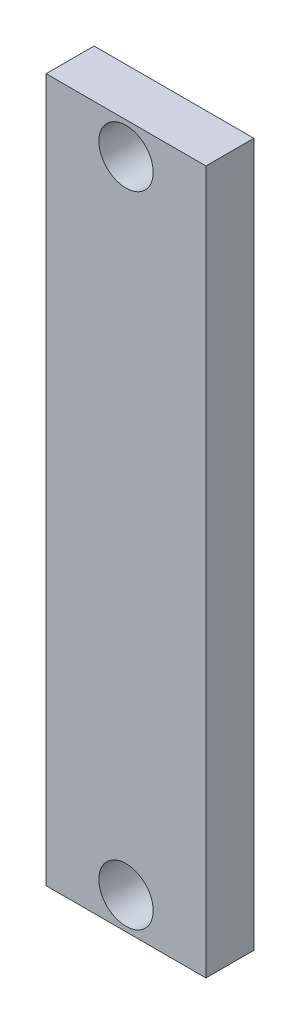
ISO-10303-21;
HEADER;
FILE_DESCRIPTION(('STEP AP214'),'2;1');
FILE_NAME('part.step','',(''),(''),'','','');
FILE_SCHEMA(('AUTOMOTIVE_DESIGN { 1 0 10303 214 1 1 1 1 }'));
ENDSEC;
DATA;
#1=APPLICATION_CONTEXT('core data for automotive mechanical design processes');
#2=APPLICATION_PROTOCOL_DEFINITION('international standard','automotive_design',2000,#1);
#3=PRODUCT_CONTEXT('',#1,'mechanical');
#4=PRODUCT('Part','Part','',(#3));
#5=PRODUCT_RELATED_PRODUCT_CATEGORY('part','',(#4));
#6=PRODUCT_DEFINITION_FORMATION('','',#4);
#7=PRODUCT_DEFINITION_CONTEXT('part definition',#1,'design');
#8=PRODUCT_DEFINITION('design','',#6,#7);
#9=PRODUCT_DEFINITION_SHAPE('','',#8);
#10=(LENGTH_UNIT() NAMED_UNIT(*) SI_UNIT(.MILLI.,.METRE.));
#11=(NAMED_UNIT(*) PLANE_ANGLE_UNIT() SI_UNIT($,.RADIAN.));
#12=(NAMED_UNIT(*) SI_UNIT($,.STERADIAN.) SOLID_ANGLE_UNIT());
#13=UNCERTAINTY_MEASURE_WITH_UNIT(LENGTH_MEASURE(1.E-05),#10,'distance_accuracy_value','');
#14=(GEOMETRIC_REPRESENTATION_CONTEXT(3) GLOBAL_UNCERTAINTY_ASSIGNED_CONTEXT((#13)) GLOBAL_UNIT_ASSIGNED_CONTEXT((#10,
#11,#12)) REPRESENTATION_CONTEXT('',''));
#15=CARTESIAN_POINT('',(0.,0.,0.));
#16=DIRECTION('',(0.,0.,1.));
#17=DIRECTION('',(1.,0.,0.));
#18=AXIS2_PLACEMENT_3D('',#15,#16,#17);
#19=CARTESIAN_POINT('',(-5.,64.,90.));
#20=DIRECTION('',(1.,0.,0.));
#21=DIRECTION('',(0.,0.,-1.));
#22=AXIS2_PLACEMENT_3D('',#19,#20,#21);
#23=PLANE('',#22);
#24=DIRECTION('',(0.,-1.,0.));
#25=VECTOR('',#24,1.);
#26=CARTESIAN_POINT('',(-5.,64.,87.));
#27=LINE('',#26,#25);
#28=CARTESIAN_POINT('',(-5.,64.,87.));
#29=VERTEX_POINT('',#28);
#30=CARTESIAN_POINT('',(-5.,20.,87.));
#31=VERTEX_POINT('',#30);
#32=EDGE_CURVE('E104',#29,#31,#27,.T.);
#33=ORIENTED_EDGE('',*,*,#32,.T.);
#34=DIRECTION('',(0.,0.,-1.));
#35=VECTOR('',#34,1.);
#36=CARTESIAN_POINT('',(-5.,20.,90.));
#37=LINE('',#36,#35);
#38=CARTESIAN_POINT('',(-5.,20.,90.));
#39=VERTEX_POINT('',#38);
#40=EDGE_CURVE('E11',#39,#31,#37,.T.);
#41=ORIENTED_EDGE('',*,*,#40,.F.);
#42=DIRECTION('',(0.,-1.,0.));
#43=VECTOR('',#42,1.);
#44=CARTESIAN_POINT('',(-5.,64.,90.));
#45=LINE('',#44,#43);
#46=CARTESIAN_POINT('',(-5.,64.,90.));
#47=VERTEX_POINT('',#46);
#48=EDGE_CURVE('E95',#47,#39,#45,.T.);
#49=ORIENTED_EDGE('',*,*,#48,.F.);
#50=DIRECTION('',(0.,0.,-1.));
#51=VECTOR('',#50,1.);
#52=CARTESIAN_POINT('',(-5.,64.,90.));
#53=LINE('',#52,#51);
#54=EDGE_CURVE('E101',#47,#29,#53,.T.);
#55=ORIENTED_EDGE('',*,*,#54,.T.);
#56=EDGE_LOOP('',(#33,#41,#49,#55));
#57=FACE_BOUND('',#56,.T.);
#58=ADVANCED_FACE('F39',(#57),#23,.F.);
#59=CARTESIAN_POINT('',(-5.,20.,90.));
#60=DIRECTION('',(0.,1.,0.));
#61=DIRECTION('',(0.,0.,1.));
#62=AXIS2_PLACEMENT_3D('',#59,#60,#61);
#63=PLANE('',#62);
#64=DIRECTION('',(1.,0.,0.));
#65=VECTOR('',#64,1.);
#66=CARTESIAN_POINT('',(-5.,20.,87.));
#67=LINE('',#66,#65);
#68=CARTESIAN_POINT('',(5.,20.,87.));
#69=VERTEX_POINT('',#68);
#70=EDGE_CURVE('E96',#31,#69,#67,.T.);
#71=ORIENTED_EDGE('',*,*,#70,.T.);
#72=DIRECTION('',(0.,0.,-1.));
#73=VECTOR('',#72,1.);
#74=CARTESIAN_POINT('',(5.,20.,90.));
#75=LINE('',#74,#73);
#76=CARTESIAN_POINT('',(5.,20.,90.));
#77=VERTEX_POINT('',#76);
#78=EDGE_CURVE('E48',#77,#69,#75,.T.);
#79=ORIENTED_EDGE('',*,*,#78,.F.);
#80=DIRECTION('',(1.,0.,0.));
#81=VECTOR('',#80,1.);
#82=CARTESIAN_POINT('',(-5.,20.,90.));
#83=LINE('',#82,#81);
#84=EDGE_CURVE('E87',#39,#77,#83,.T.);
#85=ORIENTED_EDGE('',*,*,#84,.F.);
#86=ORIENTED_EDGE('',*,*,#40,.T.);
#87=EDGE_LOOP('',(#71,#79,#85,#86));
#88=FACE_BOUND('',#87,.T.);
#89=ADVANCED_FACE('F92',(#88),#63,.F.);
#90=CARTESIAN_POINT('',(5.,20.,90.));
#91=DIRECTION('',(-1.,0.,0.));
#92=DIRECTION('',(0.,0.,1.));
#93=AXIS2_PLACEMENT_3D('',#90,#91,#92);
#94=PLANE('',#93);
#95=DIRECTION('',(0.,1.,0.));
#96=VECTOR('',#95,1.);
#97=CARTESIAN_POINT('',(5.,20.,87.));
#98=LINE('',#97,#96);
#99=CARTESIAN_POINT('',(5.,64.,87.));
#100=VERTEX_POINT('',#99);
#101=EDGE_CURVE('E74',#69,#100,#98,.T.);
#102=ORIENTED_EDGE('',*,*,#101,.T.);
#103=DIRECTION('',(0.,0.,-1.));
#104=VECTOR('',#103,1.);
#105=CARTESIAN_POINT('',(5.,64.,90.));
#106=LINE('',#105,#104);
#107=CARTESIAN_POINT('',(5.,64.,90.));
#108=VERTEX_POINT('',#107);
#109=EDGE_CURVE('E100',#108,#100,#106,.T.);
#110=ORIENTED_EDGE('',*,*,#109,.F.);
#111=DIRECTION('',(0.,1.,0.));
#112=VECTOR('',#111,1.);
#113=CARTESIAN_POINT('',(5.,20.,90.));
#114=LINE('',#113,#112);
#115=EDGE_CURVE('E89',#77,#108,#114,.T.);
#116=ORIENTED_EDGE('',*,*,#115,.F.);
#117=ORIENTED_EDGE('',*,*,#78,.T.);
#118=EDGE_LOOP('',(#102,#110,#116,#117));
#119=FACE_BOUND('',#118,.T.);
#120=ADVANCED_FACE('F97',(#119),#94,.F.);
#121=CARTESIAN_POINT('',(5.,64.,90.));
#122=DIRECTION('',(0.,-1.,0.));
#123=DIRECTION('',(0.,0.,-1.));
#124=AXIS2_PLACEMENT_3D('',#121,#122,#123);
#125=PLANE('',#124);
#126=DIRECTION('',(-1.,0.,0.));
#127=VECTOR('',#126,1.);
#128=CARTESIAN_POINT('',(5.,64.,87.));
#129=LINE('',#128,#127);
#130=EDGE_CURVE('E78',#100,#29,#129,.T.);
#131=ORIENTED_EDGE('',*,*,#130,.T.);
#132=ORIENTED_EDGE('',*,*,#54,.F.);
#133=DIRECTION('',(-1.,0.,0.));
#134=VECTOR('',#133,1.);
#135=CARTESIAN_POINT('',(5.,64.,90.));
#136=LINE('',#135,#134);
#137=EDGE_CURVE('E60',#108,#47,#136,.T.);
#138=ORIENTED_EDGE('',*,*,#137,.F.);
#139=ORIENTED_EDGE('',*,*,#109,.T.);
#140=EDGE_LOOP('',(#131,#132,#138,#139));
#141=FACE_BOUND('',#140,.T.);
#142=ADVANCED_FACE('F142',(#141),#125,.F.);
#143=CARTESIAN_POINT('',(0.,0.,90.));
#144=DIRECTION('',(0.,0.,1.));
#145=DIRECTION('',(1.,0.,0.));
#146=AXIS2_PLACEMENT_3D('',#143,#144,#145);
#147=PLANE('',#146);
#148=CARTESIAN_POINT('',(0.,62.,90.));
#149=DIRECTION('',(0.,0.,1.));
#150=DIRECTION('',(1.,0.,0.));
#151=AXIS2_PLACEMENT_3D('',#148,#149,#150);
#152=CIRCLE('',#151,1.7);
#153=CARTESIAN_POINT('',(1.7,62.,90.));
#154=VERTEX_POINT('',#153);
#155=EDGE_CURVE('E107',#154,#154,#152,.F.);
#156=ORIENTED_EDGE('',*,*,#155,.T.);
#157=EDGE_LOOP('',(#156));
#158=FACE_BOUND('',#157,.T.);
#159=CARTESIAN_POINT('',(0.,22.,90.));
#160=DIRECTION('',(0.,0.,1.));
#161=DIRECTION('',(1.,0.,0.));
#162=AXIS2_PLACEMENT_3D('',#159,#160,#161);
#163=CIRCLE('',#162,1.7);
#164=CARTESIAN_POINT('',(1.7,22.,90.));
#165=VERTEX_POINT('',#164);
#166=EDGE_CURVE('E113',#165,#165,#163,.F.);
#167=ORIENTED_EDGE('',*,*,#166,.T.);
#168=EDGE_LOOP('',(#167));
#169=FACE_BOUND('',#168,.T.);
#170=ORIENTED_EDGE('',*,*,#48,.T.);
#171=ORIENTED_EDGE('',*,*,#84,.T.);
#172=ORIENTED_EDGE('',*,*,#115,.T.);
#173=ORIENTED_EDGE('',*,*,#137,.T.);
#174=EDGE_LOOP('',(#170,#171,#172,#173));
#175=FACE_BOUND('',#174,.T.);
#176=ADVANCED_FACE('F86',(#158,#169,#175),#147,.T.);
#177=CARTESIAN_POINT('',(0.,0.,87.));
#178=DIRECTION('',(0.,0.,1.));
#179=DIRECTION('',(1.,0.,0.));
#180=AXIS2_PLACEMENT_3D('',#177,#178,#179);
#181=PLANE('',#180);
#182=CARTESIAN_POINT('',(0.,62.,87.));
#183=DIRECTION('',(0.,0.,1.));
#184=DIRECTION('',(1.,0.,0.));
#185=AXIS2_PLACEMENT_3D('',#182,#183,#184);
#186=CIRCLE('',#185,1.7);
#187=CARTESIAN_POINT('',(1.7,62.,87.));
#188=VERTEX_POINT('',#187);
#189=EDGE_CURVE('E45',#188,#188,#186,.F.);
#190=ORIENTED_EDGE('',*,*,#189,.F.);
#191=EDGE_LOOP('',(#190));
#192=FACE_BOUND('',#191,.T.);
#193=CARTESIAN_POINT('',(0.,22.,87.));
#194=DIRECTION('',(0.,0.,1.));
#195=DIRECTION('',(1.,0.,0.));
#196=AXIS2_PLACEMENT_3D('',#193,#194,#195);
#197=CIRCLE('',#196,1.7);
#198=CARTESIAN_POINT('',(1.7,22.,87.));
#199=VERTEX_POINT('',#198);
#200=EDGE_CURVE('E114',#199,#199,#197,.F.);
#201=ORIENTED_EDGE('',*,*,#200,.F.);
#202=EDGE_LOOP('',(#201));
#203=FACE_BOUND('',#202,.T.);
#204=ORIENTED_EDGE('',*,*,#32,.F.);
#205=ORIENTED_EDGE('',*,*,#130,.F.);
#206=ORIENTED_EDGE('',*,*,#101,.F.);
#207=ORIENTED_EDGE('',*,*,#70,.F.);
#208=EDGE_LOOP('',(#204,#205,#206,#207));
#209=FACE_BOUND('',#208,.T.);
#210=ADVANCED_FACE('F133',(#192,#203,#209),#181,.F.);
#211=CARTESIAN_POINT('',(0.,22.,91.));
#212=DIRECTION('',(0.,0.,-1.));
#213=DIRECTION('',(-1.,0.,0.));
#214=AXIS2_PLACEMENT_3D('',#211,#212,#213);
#215=CYLINDRICAL_SURFACE('',#214,1.7);
#216=ORIENTED_EDGE('',*,*,#166,.F.);
#217=EDGE_LOOP('',(#216));
#218=FACE_BOUND('',#217,.T.);
#219=ORIENTED_EDGE('',*,*,#200,.T.);
#220=EDGE_LOOP('',(#219));
#221=FACE_BOUND('',#220,.T.);
#222=ADVANCED_FACE('F132',(#218,#221),#215,.F.);
#223=CARTESIAN_POINT('',(0.,62.,91.));
#224=DIRECTION('',(0.,0.,-1.));
#225=DIRECTION('',(-1.,0.,0.));
#226=AXIS2_PLACEMENT_3D('',#223,#224,#225);
#227=CYLINDRICAL_SURFACE('',#226,1.7);
#228=ORIENTED_EDGE('',*,*,#155,.F.);
#229=EDGE_LOOP('',(#228));
#230=FACE_BOUND('',#229,.T.);
#231=ORIENTED_EDGE('',*,*,#189,.T.);
#232=EDGE_LOOP('',(#231));
#233=FACE_BOUND('',#232,.T.);
#234=ADVANCED_FACE('F126',(#230,#233),#227,.F.);
#235=CLOSED_SHELL('',(#58,#89,#120,#142,#176,#210,#222,#234));
#236=MANIFOLD_SOLID_BREP('B2',#235);
#237=ADVANCED_BREP_SHAPE_REPRESENTATION('',(#18,#236),#14);
#238=SHAPE_DEFINITION_REPRESENTATION(#9,#237);
ENDSEC;
END-ISO-10303-21;
